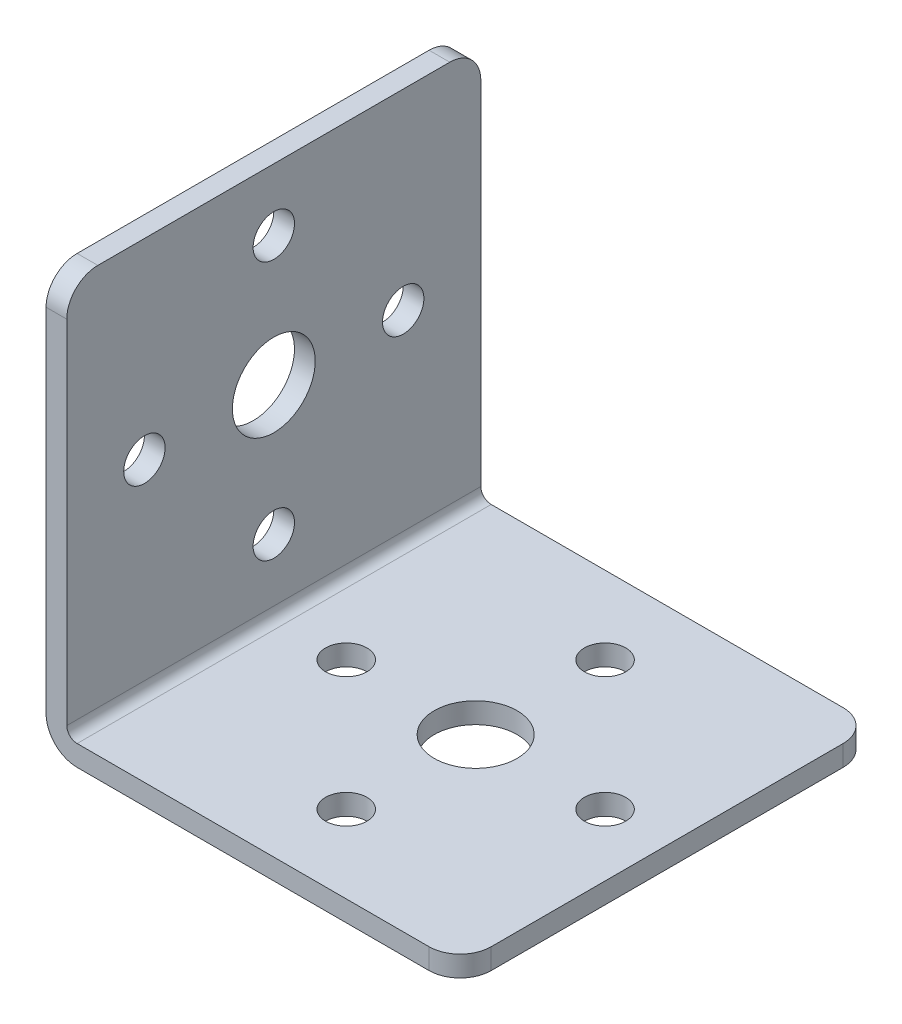
ISO-10303-21;
HEADER;
FILE_DESCRIPTION(('STEP AP214'),'2;1');
FILE_NAME('part.step','',(''),(''),'','','');
FILE_SCHEMA(('AUTOMOTIVE_DESIGN { 1 0 10303 214 1 1 1 1 }'));
ENDSEC;
DATA;
#1=APPLICATION_CONTEXT('core data for automotive mechanical design processes');
#2=APPLICATION_PROTOCOL_DEFINITION('international standard','automotive_design',2000,#1);
#3=PRODUCT_CONTEXT('',#1,'mechanical');
#4=PRODUCT('Part','Part','',(#3));
#5=PRODUCT_RELATED_PRODUCT_CATEGORY('part','',(#4));
#6=PRODUCT_DEFINITION_FORMATION('','',#4);
#7=PRODUCT_DEFINITION_CONTEXT('part definition',#1,'design');
#8=PRODUCT_DEFINITION('design','',#6,#7);
#9=PRODUCT_DEFINITION_SHAPE('','',#8);
#10=(LENGTH_UNIT() NAMED_UNIT(*) SI_UNIT(.MILLI.,.METRE.));
#11=(NAMED_UNIT(*) PLANE_ANGLE_UNIT() SI_UNIT($,.RADIAN.));
#12=(NAMED_UNIT(*) SI_UNIT($,.STERADIAN.) SOLID_ANGLE_UNIT());
#13=UNCERTAINTY_MEASURE_WITH_UNIT(LENGTH_MEASURE(1.E-05),#10,'distance_accuracy_value','');
#14=(GEOMETRIC_REPRESENTATION_CONTEXT(3) GLOBAL_UNCERTAINTY_ASSIGNED_CONTEXT((#13)) GLOBAL_UNIT_ASSIGNED_CONTEXT((#10,
#11,#12)) REPRESENTATION_CONTEXT('',''));
#15=CARTESIAN_POINT('',(0.,0.,0.));
#16=DIRECTION('',(0.,0.,1.));
#17=DIRECTION('',(1.,0.,0.));
#18=AXIS2_PLACEMENT_3D('',#15,#16,#17);
#19=CARTESIAN_POINT('',(-3.,37.,40.));
#20=DIRECTION('',(0.,-1.,0.));
#21=DIRECTION('',(0.,0.,-1.));
#22=AXIS2_PLACEMENT_3D('',#19,#20,#21);
#23=PLANE('',#22);
#24=DIRECTION('',(0.,0.,-1.));
#25=VECTOR('',#24,1.);
#26=CARTESIAN_POINT('',(-3.,37.,40.));
#27=LINE('',#26,#25);
#28=CARTESIAN_POINT('',(-3.,37.,37.));
#29=VERTEX_POINT('',#28);
#30=CARTESIAN_POINT('',(-3.,37.,3.));
#31=VERTEX_POINT('',#30);
#32=EDGE_CURVE('E142',#29,#31,#27,.T.);
#33=ORIENTED_EDGE('',*,*,#32,.F.);
#34=DIRECTION('',(-1.,0.,0.));
#35=VECTOR('',#34,1.);
#36=CARTESIAN_POINT('',(-1.,37.,37.));
#37=LINE('',#36,#35);
#38=CARTESIAN_POINT('',(-1.,37.,37.));
#39=VERTEX_POINT('',#38);
#40=EDGE_CURVE('E54',#29,#39,#37,.F.);
#41=ORIENTED_EDGE('',*,*,#40,.T.);
#42=DIRECTION('',(0.,0.,-1.));
#43=VECTOR('',#42,1.);
#44=CARTESIAN_POINT('',(-1.,37.,40.));
#45=LINE('',#44,#43);
#46=CARTESIAN_POINT('',(-1.,37.,3.));
#47=VERTEX_POINT('',#46);
#48=EDGE_CURVE('E159',#39,#47,#45,.T.);
#49=ORIENTED_EDGE('',*,*,#48,.T.);
#50=DIRECTION('',(-1.,0.,0.));
#51=VECTOR('',#50,1.);
#52=CARTESIAN_POINT('',(-3.,37.,3.));
#53=LINE('',#52,#51);
#54=EDGE_CURVE('E247',#47,#31,#53,.T.);
#55=ORIENTED_EDGE('',*,*,#54,.T.);
#56=EDGE_LOOP('',(#33,#41,#49,#55));
#57=FACE_BOUND('',#56,.T.);
#58=ADVANCED_FACE('F33',(#57),#23,.F.);
#59=CARTESIAN_POINT('',(-3.,37.,40.));
#60=DIRECTION('',(1.,0.,0.));
#61=DIRECTION('',(0.,1.,0.));
#62=AXIS2_PLACEMENT_3D('',#59,#60,#61);
#63=PLANE('',#62);
#64=CARTESIAN_POINT('',(-3.,5.99999999999999,20.));
#65=DIRECTION('',(-1.,0.,0.));
#66=DIRECTION('',(0.,-1.,0.));
#67=AXIS2_PLACEMENT_3D('',#64,#65,#66);
#68=CIRCLE('',#67,2.);
#69=CARTESIAN_POINT('',(-3.,3.99999999999999,20.));
#70=VERTEX_POINT('',#69);
#71=EDGE_CURVE('E208',#70,#70,#68,.T.);
#72=ORIENTED_EDGE('',*,*,#71,.F.);
#73=EDGE_LOOP('',(#72));
#74=FACE_BOUND('',#73,.T.);
#75=CARTESIAN_POINT('',(-3.,18.5,32.5));
#76=DIRECTION('',(-1.,0.,0.));
#77=DIRECTION('',(0.,-1.,0.));
#78=AXIS2_PLACEMENT_3D('',#75,#76,#77);
#79=CIRCLE('',#78,2.);
#80=CARTESIAN_POINT('',(-3.,16.5,32.5));
#81=VERTEX_POINT('',#80);
#82=EDGE_CURVE('E504',#81,#81,#79,.T.);
#83=ORIENTED_EDGE('',*,*,#82,.F.);
#84=EDGE_LOOP('',(#83));
#85=FACE_BOUND('',#84,.T.);
#86=CARTESIAN_POINT('',(-3.,31.,20.));
#87=DIRECTION('',(-1.,0.,0.));
#88=DIRECTION('',(0.,-1.,0.));
#89=AXIS2_PLACEMENT_3D('',#86,#87,#88);
#90=CIRCLE('',#89,2.);
#91=CARTESIAN_POINT('',(-3.,29.,20.));
#92=VERTEX_POINT('',#91);
#93=EDGE_CURVE('E501',#92,#92,#90,.T.);
#94=ORIENTED_EDGE('',*,*,#93,.F.);
#95=EDGE_LOOP('',(#94));
#96=FACE_BOUND('',#95,.T.);
#97=CARTESIAN_POINT('',(-3.,18.5,20.));
#98=DIRECTION('',(-1.,0.,0.));
#99=DIRECTION('',(0.,-1.,0.));
#100=AXIS2_PLACEMENT_3D('',#97,#98,#99);
#101=CIRCLE('',#100,4.);
#102=CARTESIAN_POINT('',(-3.,14.5,20.));
#103=VERTEX_POINT('',#102);
#104=EDGE_CURVE('E196',#103,#103,#101,.T.);
#105=ORIENTED_EDGE('',*,*,#104,.F.);
#106=EDGE_LOOP('',(#105));
#107=FACE_BOUND('',#106,.T.);
#108=CARTESIAN_POINT('',(-3.,18.5,7.5));
#109=DIRECTION('',(-1.,0.,0.));
#110=DIRECTION('',(0.,-1.,0.));
#111=AXIS2_PLACEMENT_3D('',#108,#109,#110);
#112=CIRCLE('',#111,2.);
#113=CARTESIAN_POINT('',(-3.,16.5,7.5));
#114=VERTEX_POINT('',#113);
#115=EDGE_CURVE('E191',#114,#114,#112,.T.);
#116=ORIENTED_EDGE('',*,*,#115,.F.);
#117=EDGE_LOOP('',(#116));
#118=FACE_BOUND('',#117,.T.);
#119=DIRECTION('',(0.,-1.,0.));
#120=VECTOR('',#119,1.);
#121=CARTESIAN_POINT('',(-3.,37.,40.));
#122=LINE('',#121,#120);
#123=CARTESIAN_POINT('',(-3.,34.,40.));
#124=VERTEX_POINT('',#123);
#125=CARTESIAN_POINT('',(-3.,0.,40.));
#126=VERTEX_POINT('',#125);
#127=EDGE_CURVE('E122',#124,#126,#122,.T.);
#128=ORIENTED_EDGE('',*,*,#127,.F.);
#129=CARTESIAN_POINT('',(-3.,34.,37.));
#130=DIRECTION('',(1.,0.,0.));
#131=DIRECTION('',(0.,1.,0.));
#132=AXIS2_PLACEMENT_3D('',#129,#130,#131);
#133=CIRCLE('',#132,3.);
#134=EDGE_CURVE('E245',#124,#29,#133,.F.);
#135=ORIENTED_EDGE('',*,*,#134,.T.);
#136=ORIENTED_EDGE('',*,*,#32,.T.);
#137=CARTESIAN_POINT('',(-3.,34.,3.));
#138=DIRECTION('',(1.,0.,0.));
#139=DIRECTION('',(0.,1.,0.));
#140=AXIS2_PLACEMENT_3D('',#137,#138,#139);
#141=CIRCLE('',#140,3.);
#142=CARTESIAN_POINT('',(-3.,34.,0.));
#143=VERTEX_POINT('',#142);
#144=EDGE_CURVE('E243',#31,#143,#141,.F.);
#145=ORIENTED_EDGE('',*,*,#144,.T.);
#146=DIRECTION('',(0.,-1.,0.));
#147=VECTOR('',#146,1.);
#148=CARTESIAN_POINT('',(-3.,37.,0.));
#149=LINE('',#148,#147);
#150=CARTESIAN_POINT('',(-3.,0.,0.));
#151=VERTEX_POINT('',#150);
#152=EDGE_CURVE('E139',#143,#151,#149,.T.);
#153=ORIENTED_EDGE('',*,*,#152,.T.);
#154=DIRECTION('',(0.,0.,-1.));
#155=VECTOR('',#154,1.);
#156=CARTESIAN_POINT('',(-3.,0.,40.));
#157=LINE('',#156,#155);
#158=EDGE_CURVE('E136',#126,#151,#157,.T.);
#159=ORIENTED_EDGE('',*,*,#158,.F.);
#160=EDGE_LOOP('',(#128,#135,#136,#145,#153,#159));
#161=FACE_BOUND('',#160,.T.);
#162=ADVANCED_FACE('F137',(#74,#85,#96,#107,#118,#161),#63,.F.);
#163=CARTESIAN_POINT('',(0.,0.,40.));
#164=DIRECTION('',(0.,0.,-1.));
#165=DIRECTION('',(-1.,0.,0.));
#166=AXIS2_PLACEMENT_3D('',#163,#164,#165);
#167=CYLINDRICAL_SURFACE('',#166,3.);
#168=CARTESIAN_POINT('',(0.,0.,0.));
#169=DIRECTION('',(0.,0.,1.));
#170=DIRECTION('',(1.,0.,0.));
#171=AXIS2_PLACEMENT_3D('',#168,#169,#170);
#172=CIRCLE('',#171,3.);
#173=CARTESIAN_POINT('',(0.,-3.,0.));
#174=VERTEX_POINT('',#173);
#175=EDGE_CURVE('E161',#151,#174,#172,.T.);
#176=ORIENTED_EDGE('',*,*,#175,.T.);
#177=DIRECTION('',(0.,0.,-1.));
#178=VECTOR('',#177,1.);
#179=CARTESIAN_POINT('',(0.,-3.,40.));
#180=LINE('',#179,#178);
#181=CARTESIAN_POINT('',(0.,-3.,40.));
#182=VERTEX_POINT('',#181);
#183=EDGE_CURVE('E143',#182,#174,#180,.T.);
#184=ORIENTED_EDGE('',*,*,#183,.F.);
#185=CARTESIAN_POINT('',(0.,0.,40.));
#186=DIRECTION('',(0.,0.,1.));
#187=DIRECTION('',(1.,0.,0.));
#188=AXIS2_PLACEMENT_3D('',#185,#186,#187);
#189=CIRCLE('',#188,3.);
#190=EDGE_CURVE('E127',#126,#182,#189,.T.);
#191=ORIENTED_EDGE('',*,*,#190,.F.);
#192=ORIENTED_EDGE('',*,*,#158,.T.);
#193=EDGE_LOOP('',(#176,#184,#191,#192));
#194=FACE_BOUND('',#193,.T.);
#195=ADVANCED_FACE('F145',(#194),#167,.T.);
#196=CARTESIAN_POINT('',(0.,-3.,40.));
#197=DIRECTION('',(0.,1.,0.));
#198=DIRECTION('',(0.,0.,1.));
#199=AXIS2_PLACEMENT_3D('',#196,#197,#198);
#200=PLANE('',#199);
#201=CARTESIAN_POINT('',(31.,-3.,20.));
#202=DIRECTION('',(0.,-1.,0.));
#203=DIRECTION('',(1.,0.,0.));
#204=AXIS2_PLACEMENT_3D('',#201,#202,#203);
#205=CIRCLE('',#204,2.);
#206=CARTESIAN_POINT('',(33.,-3.,20.));
#207=VERTEX_POINT('',#206);
#208=EDGE_CURVE('E519',#207,#207,#205,.T.);
#209=ORIENTED_EDGE('',*,*,#208,.F.);
#210=EDGE_LOOP('',(#209));
#211=FACE_BOUND('',#210,.T.);
#212=CARTESIAN_POINT('',(18.5,-3.,32.5));
#213=DIRECTION('',(0.,-1.,0.));
#214=DIRECTION('',(1.,0.,0.));
#215=AXIS2_PLACEMENT_3D('',#212,#213,#214);
#216=CIRCLE('',#215,2.);
#217=CARTESIAN_POINT('',(20.5,-3.,32.5));
#218=VERTEX_POINT('',#217);
#219=EDGE_CURVE('E516',#218,#218,#216,.T.);
#220=ORIENTED_EDGE('',*,*,#219,.F.);
#221=EDGE_LOOP('',(#220));
#222=FACE_BOUND('',#221,.T.);
#223=CARTESIAN_POINT('',(5.99999999999999,-3.,20.));
#224=DIRECTION('',(0.,-1.,0.));
#225=DIRECTION('',(1.,0.,0.));
#226=AXIS2_PLACEMENT_3D('',#223,#224,#225);
#227=CIRCLE('',#226,2.);
#228=CARTESIAN_POINT('',(7.99999999999999,-3.,20.));
#229=VERTEX_POINT('',#228);
#230=EDGE_CURVE('E513',#229,#229,#227,.T.);
#231=ORIENTED_EDGE('',*,*,#230,.F.);
#232=EDGE_LOOP('',(#231));
#233=FACE_BOUND('',#232,.T.);
#234=CARTESIAN_POINT('',(18.5,-3.,20.));
#235=DIRECTION('',(0.,-1.,0.));
#236=DIRECTION('',(1.,0.,0.));
#237=AXIS2_PLACEMENT_3D('',#234,#235,#236);
#238=CIRCLE('',#237,4.);
#239=CARTESIAN_POINT('',(22.5,-3.,20.));
#240=VERTEX_POINT('',#239);
#241=EDGE_CURVE('E214',#240,#240,#238,.T.);
#242=ORIENTED_EDGE('',*,*,#241,.F.);
#243=EDGE_LOOP('',(#242));
#244=FACE_BOUND('',#243,.T.);
#245=CARTESIAN_POINT('',(18.5,-3.,7.5));
#246=DIRECTION('',(0.,-1.,0.));
#247=DIRECTION('',(1.,0.,0.));
#248=AXIS2_PLACEMENT_3D('',#245,#246,#247);
#249=CIRCLE('',#248,2.);
#250=CARTESIAN_POINT('',(20.5,-3.,7.5));
#251=VERTEX_POINT('',#250);
#252=EDGE_CURVE('E209',#251,#251,#249,.T.);
#253=ORIENTED_EDGE('',*,*,#252,.F.);
#254=EDGE_LOOP('',(#253));
#255=FACE_BOUND('',#254,.T.);
#256=DIRECTION('',(1.,0.,0.));
#257=VECTOR('',#256,1.);
#258=CARTESIAN_POINT('',(0.,-3.,0.));
#259=LINE('',#258,#257);
#260=CARTESIAN_POINT('',(34.,-3.,0.));
#261=VERTEX_POINT('',#260);
#262=EDGE_CURVE('E164',#174,#261,#259,.T.);
#263=ORIENTED_EDGE('',*,*,#262,.T.);
#264=CARTESIAN_POINT('',(34.,-3.,3.));
#265=DIRECTION('',(0.,1.,0.));
#266=DIRECTION('',(0.,0.,1.));
#267=AXIS2_PLACEMENT_3D('',#264,#265,#266);
#268=CIRCLE('',#267,3.);
#269=CARTESIAN_POINT('',(37.,-3.,3.));
#270=VERTEX_POINT('',#269);
#271=EDGE_CURVE('E237',#261,#270,#268,.F.);
#272=ORIENTED_EDGE('',*,*,#271,.T.);
#273=DIRECTION('',(0.,0.,-1.));
#274=VECTOR('',#273,1.);
#275=CARTESIAN_POINT('',(37.,-3.,40.));
#276=LINE('',#275,#274);
#277=CARTESIAN_POINT('',(37.,-3.,37.));
#278=VERTEX_POINT('',#277);
#279=EDGE_CURVE('E182',#278,#270,#276,.T.);
#280=ORIENTED_EDGE('',*,*,#279,.F.);
#281=CARTESIAN_POINT('',(34.,-3.,37.));
#282=DIRECTION('',(0.,1.,0.));
#283=DIRECTION('',(0.,0.,1.));
#284=AXIS2_PLACEMENT_3D('',#281,#282,#283);
#285=CIRCLE('',#284,3.);
#286=CARTESIAN_POINT('',(34.,-3.,40.));
#287=VERTEX_POINT('',#286);
#288=EDGE_CURVE('E235',#278,#287,#285,.F.);
#289=ORIENTED_EDGE('',*,*,#288,.T.);
#290=DIRECTION('',(1.,0.,0.));
#291=VECTOR('',#290,1.);
#292=CARTESIAN_POINT('',(0.,-3.,40.));
#293=LINE('',#292,#291);
#294=EDGE_CURVE('E148',#182,#287,#293,.T.);
#295=ORIENTED_EDGE('',*,*,#294,.F.);
#296=ORIENTED_EDGE('',*,*,#183,.T.);
#297=EDGE_LOOP('',(#263,#272,#280,#289,#295,#296));
#298=FACE_BOUND('',#297,.T.);
#299=ADVANCED_FACE('F297',(#211,#222,#233,#244,#255,#298),#200,.F.);
#300=CARTESIAN_POINT('',(37.,-1.,40.));
#301=DIRECTION('',(-1.,0.,0.));
#302=DIRECTION('',(0.,0.,1.));
#303=AXIS2_PLACEMENT_3D('',#300,#301,#302);
#304=PLANE('',#303);
#305=ORIENTED_EDGE('',*,*,#279,.T.);
#306=DIRECTION('',(0.,1.,0.));
#307=VECTOR('',#306,1.);
#308=CARTESIAN_POINT('',(37.,-1.,3.));
#309=LINE('',#308,#307);
#310=CARTESIAN_POINT('',(37.,-1.,3.));
#311=VERTEX_POINT('',#310);
#312=EDGE_CURVE('E224',#270,#311,#309,.T.);
#313=ORIENTED_EDGE('',*,*,#312,.T.);
#314=DIRECTION('',(0.,0.,-1.));
#315=VECTOR('',#314,1.);
#316=CARTESIAN_POINT('',(37.,-1.,40.));
#317=LINE('',#316,#315);
#318=CARTESIAN_POINT('',(37.,-1.,37.));
#319=VERTEX_POINT('',#318);
#320=EDGE_CURVE('E179',#319,#311,#317,.T.);
#321=ORIENTED_EDGE('',*,*,#320,.F.);
#322=DIRECTION('',(0.,1.,0.));
#323=VECTOR('',#322,1.);
#324=CARTESIAN_POINT('',(37.,-3.,37.));
#325=LINE('',#324,#323);
#326=EDGE_CURVE('E188',#319,#278,#325,.F.);
#327=ORIENTED_EDGE('',*,*,#326,.T.);
#328=EDGE_LOOP('',(#305,#313,#321,#327));
#329=FACE_BOUND('',#328,.T.);
#330=ADVANCED_FACE('F306',(#329),#304,.F.);
#331=CARTESIAN_POINT('',(0.,-1.,40.));
#332=DIRECTION('',(0.,-1.,0.));
#333=DIRECTION('',(0.,0.,-1.));
#334=AXIS2_PLACEMENT_3D('',#331,#332,#333);
#335=PLANE('',#334);
#336=CARTESIAN_POINT('',(31.,-1.,20.));
#337=DIRECTION('',(0.,-1.,0.));
#338=DIRECTION('',(0.,0.,-1.));
#339=AXIS2_PLACEMENT_3D('',#336,#337,#338);
#340=CIRCLE('',#339,2.);
#341=CARTESIAN_POINT('',(31.,-1.,18.));
#342=VERTEX_POINT('',#341);
#343=EDGE_CURVE('E220',#342,#342,#340,.T.);
#344=ORIENTED_EDGE('',*,*,#343,.T.);
#345=EDGE_LOOP('',(#344));
#346=FACE_BOUND('',#345,.T.);
#347=CARTESIAN_POINT('',(18.5,-1.,32.5));
#348=DIRECTION('',(0.,-1.,0.));
#349=DIRECTION('',(0.,0.,-1.));
#350=AXIS2_PLACEMENT_3D('',#347,#348,#349);
#351=CIRCLE('',#350,2.);
#352=CARTESIAN_POINT('',(18.5,-1.,30.5));
#353=VERTEX_POINT('',#352);
#354=EDGE_CURVE('E217',#353,#353,#351,.T.);
#355=ORIENTED_EDGE('',*,*,#354,.T.);
#356=EDGE_LOOP('',(#355));
#357=FACE_BOUND('',#356,.T.);
#358=CARTESIAN_POINT('',(5.99999999999999,-1.,20.));
#359=DIRECTION('',(0.,-1.,0.));
#360=DIRECTION('',(0.,0.,-1.));
#361=AXIS2_PLACEMENT_3D('',#358,#359,#360);
#362=CIRCLE('',#361,2.);
#363=CARTESIAN_POINT('',(5.99999999999999,-1.,18.));
#364=VERTEX_POINT('',#363);
#365=EDGE_CURVE('E213',#364,#364,#362,.T.);
#366=ORIENTED_EDGE('',*,*,#365,.T.);
#367=EDGE_LOOP('',(#366));
#368=FACE_BOUND('',#367,.T.);
#369=CARTESIAN_POINT('',(18.5,-1.,20.));
#370=DIRECTION('',(0.,-1.,0.));
#371=DIRECTION('',(0.,0.,-1.));
#372=AXIS2_PLACEMENT_3D('',#369,#370,#371);
#373=CIRCLE('',#372,4.);
#374=CARTESIAN_POINT('',(18.5,-1.,16.));
#375=VERTEX_POINT('',#374);
#376=EDGE_CURVE('E210',#375,#375,#373,.T.);
#377=ORIENTED_EDGE('',*,*,#376,.T.);
#378=EDGE_LOOP('',(#377));
#379=FACE_BOUND('',#378,.T.);
#380=CARTESIAN_POINT('',(18.5,-1.,7.5));
#381=DIRECTION('',(0.,-1.,0.));
#382=DIRECTION('',(0.,0.,-1.));
#383=AXIS2_PLACEMENT_3D('',#380,#381,#382);
#384=CIRCLE('',#383,2.);
#385=CARTESIAN_POINT('',(18.5,-1.,5.5));
#386=VERTEX_POINT('',#385);
#387=EDGE_CURVE('E205',#386,#386,#384,.T.);
#388=ORIENTED_EDGE('',*,*,#387,.T.);
#389=EDGE_LOOP('',(#388));
#390=FACE_BOUND('',#389,.T.);
#391=ORIENTED_EDGE('',*,*,#320,.T.);
#392=CARTESIAN_POINT('',(34.,-1.,3.));
#393=DIRECTION('',(0.,-1.,0.));
#394=DIRECTION('',(0.,0.,-1.));
#395=AXIS2_PLACEMENT_3D('',#392,#393,#394);
#396=CIRCLE('',#395,3.);
#397=CARTESIAN_POINT('',(34.,-1.,0.));
#398=VERTEX_POINT('',#397);
#399=EDGE_CURVE('E229',#311,#398,#396,.F.);
#400=ORIENTED_EDGE('',*,*,#399,.T.);
#401=DIRECTION('',(-1.,0.,0.));
#402=VECTOR('',#401,1.);
#403=CARTESIAN_POINT('',(0.,-1.,0.));
#404=LINE('',#403,#402);
#405=CARTESIAN_POINT('',(0.,-1.,0.));
#406=VERTEX_POINT('',#405);
#407=EDGE_CURVE('E167',#398,#406,#404,.T.);
#408=ORIENTED_EDGE('',*,*,#407,.T.);
#409=DIRECTION('',(0.,0.,-1.));
#410=VECTOR('',#409,1.);
#411=CARTESIAN_POINT('',(0.,-1.,40.));
#412=LINE('',#411,#410);
#413=CARTESIAN_POINT('',(0.,-1.,40.));
#414=VERTEX_POINT('',#413);
#415=EDGE_CURVE('E176',#414,#406,#412,.T.);
#416=ORIENTED_EDGE('',*,*,#415,.F.);
#417=DIRECTION('',(-1.,0.,0.));
#418=VECTOR('',#417,1.);
#419=CARTESIAN_POINT('',(0.,-1.,40.));
#420=LINE('',#419,#418);
#421=CARTESIAN_POINT('',(34.,-1.,40.));
#422=VERTEX_POINT('',#421);
#423=EDGE_CURVE('E150',#422,#414,#420,.T.);
#424=ORIENTED_EDGE('',*,*,#423,.F.);
#425=CARTESIAN_POINT('',(34.,-1.,37.));
#426=DIRECTION('',(0.,-1.,0.));
#427=DIRECTION('',(0.,0.,-1.));
#428=AXIS2_PLACEMENT_3D('',#425,#426,#427);
#429=CIRCLE('',#428,3.);
#430=EDGE_CURVE('E227',#422,#319,#429,.F.);
#431=ORIENTED_EDGE('',*,*,#430,.T.);
#432=EDGE_LOOP('',(#391,#400,#408,#416,#424,#431));
#433=FACE_BOUND('',#432,.T.);
#434=ADVANCED_FACE('F299',(#346,#357,#368,#379,#390,#433),#335,.F.);
#435=CARTESIAN_POINT('',(0.,0.,40.));
#436=DIRECTION('',(0.,0.,-1.));
#437=DIRECTION('',(-1.,0.,0.));
#438=AXIS2_PLACEMENT_3D('',#435,#436,#437);
#439=CYLINDRICAL_SURFACE('',#438,1.);
#440=CARTESIAN_POINT('',(0.,0.,0.));
#441=DIRECTION('',(0.,0.,-1.));
#442=DIRECTION('',(1.,0.,0.));
#443=AXIS2_PLACEMENT_3D('',#440,#441,#442);
#444=CIRCLE('',#443,1.);
#445=CARTESIAN_POINT('',(-1.,0.,0.));
#446=VERTEX_POINT('',#445);
#447=EDGE_CURVE('E169',#406,#446,#444,.T.);
#448=ORIENTED_EDGE('',*,*,#447,.T.);
#449=DIRECTION('',(0.,0.,-1.));
#450=VECTOR('',#449,1.);
#451=CARTESIAN_POINT('',(-1.,0.,40.));
#452=LINE('',#451,#450);
#453=CARTESIAN_POINT('',(-1.,0.,40.));
#454=VERTEX_POINT('',#453);
#455=EDGE_CURVE('E173',#454,#446,#452,.T.);
#456=ORIENTED_EDGE('',*,*,#455,.F.);
#457=CARTESIAN_POINT('',(0.,0.,40.));
#458=DIRECTION('',(0.,0.,-1.));
#459=DIRECTION('',(1.,0.,0.));
#460=AXIS2_PLACEMENT_3D('',#457,#458,#459);
#461=CIRCLE('',#460,1.);
#462=EDGE_CURVE('E155',#414,#454,#461,.T.);
#463=ORIENTED_EDGE('',*,*,#462,.F.);
#464=ORIENTED_EDGE('',*,*,#415,.T.);
#465=EDGE_LOOP('',(#448,#456,#463,#464));
#466=FACE_BOUND('',#465,.T.);
#467=ADVANCED_FACE('F262',(#466),#439,.F.);
#468=CARTESIAN_POINT('',(-1.,37.,40.));
#469=DIRECTION('',(-1.,0.,0.));
#470=DIRECTION('',(0.,-1.,0.));
#471=AXIS2_PLACEMENT_3D('',#468,#469,#470);
#472=PLANE('',#471);
#473=CARTESIAN_POINT('',(-1.,5.99999999999999,20.));
#474=DIRECTION('',(-1.,0.,0.));
#475=DIRECTION('',(0.,-1.,0.));
#476=AXIS2_PLACEMENT_3D('',#473,#474,#475);
#477=CIRCLE('',#476,2.);
#478=CARTESIAN_POINT('',(-1.,3.99999999999999,20.));
#479=VERTEX_POINT('',#478);
#480=EDGE_CURVE('E202',#479,#479,#477,.T.);
#481=ORIENTED_EDGE('',*,*,#480,.T.);
#482=EDGE_LOOP('',(#481));
#483=FACE_BOUND('',#482,.T.);
#484=CARTESIAN_POINT('',(-1.00000000000001,18.5,32.5));
#485=DIRECTION('',(-1.,0.,0.));
#486=DIRECTION('',(0.,-1.,0.));
#487=AXIS2_PLACEMENT_3D('',#484,#485,#486);
#488=CIRCLE('',#487,2.);
#489=CARTESIAN_POINT('',(-1.00000000000001,16.5,32.5));
#490=VERTEX_POINT('',#489);
#491=EDGE_CURVE('E199',#490,#490,#488,.T.);
#492=ORIENTED_EDGE('',*,*,#491,.T.);
#493=EDGE_LOOP('',(#492));
#494=FACE_BOUND('',#493,.T.);
#495=CARTESIAN_POINT('',(-1.00000000000001,31.,20.));
#496=DIRECTION('',(-1.,0.,0.));
#497=DIRECTION('',(0.,-1.,0.));
#498=AXIS2_PLACEMENT_3D('',#495,#496,#497);
#499=CIRCLE('',#498,2.);
#500=CARTESIAN_POINT('',(-1.00000000000001,29.,20.));
#501=VERTEX_POINT('',#500);
#502=EDGE_CURVE('E195',#501,#501,#499,.T.);
#503=ORIENTED_EDGE('',*,*,#502,.T.);
#504=EDGE_LOOP('',(#503));
#505=FACE_BOUND('',#504,.T.);
#506=CARTESIAN_POINT('',(-1.00000000000001,18.5,20.));
#507=DIRECTION('',(-1.,0.,0.));
#508=DIRECTION('',(0.,-1.,0.));
#509=AXIS2_PLACEMENT_3D('',#506,#507,#508);
#510=CIRCLE('',#509,4.);
#511=CARTESIAN_POINT('',(-1.00000000000001,14.5,20.));
#512=VERTEX_POINT('',#511);
#513=EDGE_CURVE('E192',#512,#512,#510,.T.);
#514=ORIENTED_EDGE('',*,*,#513,.T.);
#515=EDGE_LOOP('',(#514));
#516=FACE_BOUND('',#515,.T.);
#517=CARTESIAN_POINT('',(-1.00000000000001,18.5,7.5));
#518=DIRECTION('',(-1.,0.,0.));
#519=DIRECTION('',(0.,-1.,0.));
#520=AXIS2_PLACEMENT_3D('',#517,#518,#519);
#521=CIRCLE('',#520,2.);
#522=CARTESIAN_POINT('',(-1.00000000000001,16.5,7.5));
#523=VERTEX_POINT('',#522);
#524=EDGE_CURVE('E162',#523,#523,#521,.T.);
#525=ORIENTED_EDGE('',*,*,#524,.T.);
#526=EDGE_LOOP('',(#525));
#527=FACE_BOUND('',#526,.T.);
#528=ORIENTED_EDGE('',*,*,#48,.F.);
#529=CARTESIAN_POINT('',(-1.,34.,37.));
#530=DIRECTION('',(-1.,0.,0.));
#531=DIRECTION('',(0.,-1.,0.));
#532=AXIS2_PLACEMENT_3D('',#529,#530,#531);
#533=CIRCLE('',#532,3.);
#534=CARTESIAN_POINT('',(-1.,34.,40.));
#535=VERTEX_POINT('',#534);
#536=EDGE_CURVE('E11',#39,#535,#533,.F.);
#537=ORIENTED_EDGE('',*,*,#536,.T.);
#538=DIRECTION('',(0.,1.,0.));
#539=VECTOR('',#538,1.);
#540=CARTESIAN_POINT('',(-1.,37.,40.));
#541=LINE('',#540,#539);
#542=EDGE_CURVE('E157',#454,#535,#541,.T.);
#543=ORIENTED_EDGE('',*,*,#542,.F.);
#544=ORIENTED_EDGE('',*,*,#455,.T.);
#545=DIRECTION('',(0.,1.,0.));
#546=VECTOR('',#545,1.);
#547=CARTESIAN_POINT('',(-1.,37.,0.));
#548=LINE('',#547,#546);
#549=CARTESIAN_POINT('',(-1.,34.,0.));
#550=VERTEX_POINT('',#549);
#551=EDGE_CURVE('E133',#446,#550,#548,.T.);
#552=ORIENTED_EDGE('',*,*,#551,.T.);
#553=CARTESIAN_POINT('',(-1.,34.,3.));
#554=DIRECTION('',(-1.,0.,0.));
#555=DIRECTION('',(0.,-1.,0.));
#556=AXIS2_PLACEMENT_3D('',#553,#554,#555);
#557=CIRCLE('',#556,3.);
#558=EDGE_CURVE('E41',#550,#47,#557,.F.);
#559=ORIENTED_EDGE('',*,*,#558,.T.);
#560=EDGE_LOOP('',(#528,#537,#543,#544,#552,#559));
#561=FACE_BOUND('',#560,.T.);
#562=ADVANCED_FACE('F256',(#483,#494,#505,#516,#527,#561),#472,.F.);
#563=CARTESIAN_POINT('',(0.,0.,40.));
#564=DIRECTION('',(0.,0.,1.));
#565=DIRECTION('',(1.,0.,0.));
#566=AXIS2_PLACEMENT_3D('',#563,#564,#565);
#567=PLANE('',#566);
#568=ORIENTED_EDGE('',*,*,#294,.T.);
#569=DIRECTION('',(0.,1.,0.));
#570=VECTOR('',#569,1.);
#571=CARTESIAN_POINT('',(34.,-1.,40.));
#572=LINE('',#571,#570);
#573=EDGE_CURVE('E240',#287,#422,#572,.T.);
#574=ORIENTED_EDGE('',*,*,#573,.T.);
#575=ORIENTED_EDGE('',*,*,#423,.T.);
#576=ORIENTED_EDGE('',*,*,#462,.T.);
#577=ORIENTED_EDGE('',*,*,#542,.T.);
#578=DIRECTION('',(-1.,0.,0.));
#579=VECTOR('',#578,1.);
#580=CARTESIAN_POINT('',(-3.,34.,40.));
#581=LINE('',#580,#579);
#582=EDGE_CURVE('E131',#535,#124,#581,.T.);
#583=ORIENTED_EDGE('',*,*,#582,.T.);
#584=ORIENTED_EDGE('',*,*,#127,.T.);
#585=ORIENTED_EDGE('',*,*,#190,.T.);
#586=EDGE_LOOP('',(#568,#574,#575,#576,#577,#583,#584,#585));
#587=FACE_BOUND('',#586,.T.);
#588=ADVANCED_FACE('F125',(#587),#567,.T.);
#589=CARTESIAN_POINT('',(0.,0.,0.));
#590=DIRECTION('',(0.,0.,1.));
#591=DIRECTION('',(1.,0.,0.));
#592=AXIS2_PLACEMENT_3D('',#589,#590,#591);
#593=PLANE('',#592);
#594=ORIENTED_EDGE('',*,*,#407,.F.);
#595=DIRECTION('',(0.,1.,0.));
#596=VECTOR('',#595,1.);
#597=CARTESIAN_POINT('',(34.,0.,0.));
#598=LINE('',#597,#596);
#599=EDGE_CURVE('E233',#398,#261,#598,.F.);
#600=ORIENTED_EDGE('',*,*,#599,.T.);
#601=ORIENTED_EDGE('',*,*,#262,.F.);
#602=ORIENTED_EDGE('',*,*,#175,.F.);
#603=ORIENTED_EDGE('',*,*,#152,.F.);
#604=DIRECTION('',(-1.,0.,0.));
#605=VECTOR('',#604,1.);
#606=CARTESIAN_POINT('',(0.,34.,0.));
#607=LINE('',#606,#605);
#608=EDGE_CURVE('E231',#143,#550,#607,.F.);
#609=ORIENTED_EDGE('',*,*,#608,.T.);
#610=ORIENTED_EDGE('',*,*,#551,.F.);
#611=ORIENTED_EDGE('',*,*,#447,.F.);
#612=EDGE_LOOP('',(#594,#600,#601,#602,#603,#609,#610,#611));
#613=FACE_BOUND('',#612,.T.);
#614=ADVANCED_FACE('F267',(#613),#593,.F.);
#615=CARTESIAN_POINT('',(37.,18.5,7.5));
#616=DIRECTION('',(-1.,0.,0.));
#617=DIRECTION('',(0.,-1.,0.));
#618=AXIS2_PLACEMENT_3D('',#615,#616,#617);
#619=CYLINDRICAL_SURFACE('',#618,2.);
#620=ORIENTED_EDGE('',*,*,#115,.T.);
#621=EDGE_LOOP('',(#620));
#622=FACE_BOUND('',#621,.T.);
#623=ORIENTED_EDGE('',*,*,#524,.F.);
#624=EDGE_LOOP('',(#623));
#625=FACE_BOUND('',#624,.T.);
#626=ADVANCED_FACE('F368',(#622,#625),#619,.F.);
#627=CARTESIAN_POINT('',(37.,18.5,20.));
#628=DIRECTION('',(-1.,0.,0.));
#629=DIRECTION('',(0.,-1.,0.));
#630=AXIS2_PLACEMENT_3D('',#627,#628,#629);
#631=CYLINDRICAL_SURFACE('',#630,4.);
#632=ORIENTED_EDGE('',*,*,#104,.T.);
#633=EDGE_LOOP('',(#632));
#634=FACE_BOUND('',#633,.T.);
#635=ORIENTED_EDGE('',*,*,#513,.F.);
#636=EDGE_LOOP('',(#635));
#637=FACE_BOUND('',#636,.T.);
#638=ADVANCED_FACE('F454',(#634,#637),#631,.F.);
#639=CARTESIAN_POINT('',(37.,31.,20.));
#640=DIRECTION('',(-1.,0.,0.));
#641=DIRECTION('',(0.,-1.,0.));
#642=AXIS2_PLACEMENT_3D('',#639,#640,#641);
#643=CYLINDRICAL_SURFACE('',#642,2.);
#644=ORIENTED_EDGE('',*,*,#93,.T.);
#645=EDGE_LOOP('',(#644));
#646=FACE_BOUND('',#645,.T.);
#647=ORIENTED_EDGE('',*,*,#502,.F.);
#648=EDGE_LOOP('',(#647));
#649=FACE_BOUND('',#648,.T.);
#650=ADVANCED_FACE('F446',(#646,#649),#643,.F.);
#651=CARTESIAN_POINT('',(37.,18.5,32.5));
#652=DIRECTION('',(-1.,0.,0.));
#653=DIRECTION('',(0.,-1.,0.));
#654=AXIS2_PLACEMENT_3D('',#651,#652,#653);
#655=CYLINDRICAL_SURFACE('',#654,2.);
#656=ORIENTED_EDGE('',*,*,#82,.T.);
#657=EDGE_LOOP('',(#656));
#658=FACE_BOUND('',#657,.T.);
#659=ORIENTED_EDGE('',*,*,#491,.F.);
#660=EDGE_LOOP('',(#659));
#661=FACE_BOUND('',#660,.T.);
#662=ADVANCED_FACE('F438',(#658,#661),#655,.F.);
#663=CARTESIAN_POINT('',(37.,6.,20.));
#664=DIRECTION('',(-1.,0.,0.));
#665=DIRECTION('',(0.,-1.,0.));
#666=AXIS2_PLACEMENT_3D('',#663,#664,#665);
#667=CYLINDRICAL_SURFACE('',#666,2.);
#668=ORIENTED_EDGE('',*,*,#71,.T.);
#669=EDGE_LOOP('',(#668));
#670=FACE_BOUND('',#669,.T.);
#671=ORIENTED_EDGE('',*,*,#480,.F.);
#672=EDGE_LOOP('',(#671));
#673=FACE_BOUND('',#672,.T.);
#674=ADVANCED_FACE('F430',(#670,#673),#667,.F.);
#675=CARTESIAN_POINT('',(18.5,37.,7.5));
#676=DIRECTION('',(0.,-1.,0.));
#677=DIRECTION('',(1.,0.,0.));
#678=AXIS2_PLACEMENT_3D('',#675,#676,#677);
#679=CYLINDRICAL_SURFACE('',#678,2.);
#680=ORIENTED_EDGE('',*,*,#252,.T.);
#681=EDGE_LOOP('',(#680));
#682=FACE_BOUND('',#681,.T.);
#683=ORIENTED_EDGE('',*,*,#387,.F.);
#684=EDGE_LOOP('',(#683));
#685=FACE_BOUND('',#684,.T.);
#686=ADVANCED_FACE('F422',(#682,#685),#679,.F.);
#687=CARTESIAN_POINT('',(18.5,37.,20.));
#688=DIRECTION('',(0.,-1.,0.));
#689=DIRECTION('',(1.,0.,0.));
#690=AXIS2_PLACEMENT_3D('',#687,#688,#689);
#691=CYLINDRICAL_SURFACE('',#690,4.);
#692=ORIENTED_EDGE('',*,*,#241,.T.);
#693=EDGE_LOOP('',(#692));
#694=FACE_BOUND('',#693,.T.);
#695=ORIENTED_EDGE('',*,*,#376,.F.);
#696=EDGE_LOOP('',(#695));
#697=FACE_BOUND('',#696,.T.);
#698=ADVANCED_FACE('F414',(#694,#697),#691,.F.);
#699=CARTESIAN_POINT('',(5.99999999999999,37.,20.));
#700=DIRECTION('',(0.,-1.,0.));
#701=DIRECTION('',(1.,0.,0.));
#702=AXIS2_PLACEMENT_3D('',#699,#700,#701);
#703=CYLINDRICAL_SURFACE('',#702,2.);
#704=ORIENTED_EDGE('',*,*,#230,.T.);
#705=EDGE_LOOP('',(#704));
#706=FACE_BOUND('',#705,.T.);
#707=ORIENTED_EDGE('',*,*,#365,.F.);
#708=EDGE_LOOP('',(#707));
#709=FACE_BOUND('',#708,.T.);
#710=ADVANCED_FACE('F406',(#706,#709),#703,.F.);
#711=CARTESIAN_POINT('',(18.5,37.,32.5));
#712=DIRECTION('',(0.,-1.,0.));
#713=DIRECTION('',(1.,0.,0.));
#714=AXIS2_PLACEMENT_3D('',#711,#712,#713);
#715=CYLINDRICAL_SURFACE('',#714,2.);
#716=ORIENTED_EDGE('',*,*,#219,.T.);
#717=EDGE_LOOP('',(#716));
#718=FACE_BOUND('',#717,.T.);
#719=ORIENTED_EDGE('',*,*,#354,.F.);
#720=EDGE_LOOP('',(#719));
#721=FACE_BOUND('',#720,.T.);
#722=ADVANCED_FACE('F399',(#718,#721),#715,.F.);
#723=CARTESIAN_POINT('',(31.,37.,20.));
#724=DIRECTION('',(0.,-1.,0.));
#725=DIRECTION('',(1.,0.,0.));
#726=AXIS2_PLACEMENT_3D('',#723,#724,#725);
#727=CYLINDRICAL_SURFACE('',#726,2.);
#728=ORIENTED_EDGE('',*,*,#208,.T.);
#729=EDGE_LOOP('',(#728));
#730=FACE_BOUND('',#729,.T.);
#731=ORIENTED_EDGE('',*,*,#343,.F.);
#732=EDGE_LOOP('',(#731));
#733=FACE_BOUND('',#732,.T.);
#734=ADVANCED_FACE('F286',(#730,#733),#727,.F.);
#735=CARTESIAN_POINT('',(34.,-1.,3.));
#736=DIRECTION('',(0.,1.,0.));
#737=DIRECTION('',(0.,0.,1.));
#738=AXIS2_PLACEMENT_3D('',#735,#736,#737);
#739=CYLINDRICAL_SURFACE('',#738,3.);
#740=ORIENTED_EDGE('',*,*,#271,.F.);
#741=ORIENTED_EDGE('',*,*,#599,.F.);
#742=ORIENTED_EDGE('',*,*,#399,.F.);
#743=ORIENTED_EDGE('',*,*,#312,.F.);
#744=EDGE_LOOP('',(#740,#741,#742,#743));
#745=FACE_BOUND('',#744,.T.);
#746=ADVANCED_FACE('F283',(#745),#739,.T.);
#747=CARTESIAN_POINT('',(34.,0.,37.));
#748=DIRECTION('',(0.,-1.,0.));
#749=DIRECTION('',(0.,0.,-1.));
#750=AXIS2_PLACEMENT_3D('',#747,#748,#749);
#751=CYLINDRICAL_SURFACE('',#750,3.);
#752=ORIENTED_EDGE('',*,*,#288,.F.);
#753=ORIENTED_EDGE('',*,*,#326,.F.);
#754=ORIENTED_EDGE('',*,*,#430,.F.);
#755=ORIENTED_EDGE('',*,*,#573,.F.);
#756=EDGE_LOOP('',(#752,#753,#754,#755));
#757=FACE_BOUND('',#756,.T.);
#758=ADVANCED_FACE('F273',(#757),#751,.T.);
#759=CARTESIAN_POINT('',(0.,34.,37.));
#760=DIRECTION('',(1.,0.,0.));
#761=DIRECTION('',(0.,0.,-1.));
#762=AXIS2_PLACEMENT_3D('',#759,#760,#761);
#763=CYLINDRICAL_SURFACE('',#762,3.);
#764=ORIENTED_EDGE('',*,*,#536,.F.);
#765=ORIENTED_EDGE('',*,*,#40,.F.);
#766=ORIENTED_EDGE('',*,*,#134,.F.);
#767=ORIENTED_EDGE('',*,*,#582,.F.);
#768=EDGE_LOOP('',(#764,#765,#766,#767));
#769=FACE_BOUND('',#768,.T.);
#770=ADVANCED_FACE('F254',(#769),#763,.T.);
#771=CARTESIAN_POINT('',(-3.,34.,3.));
#772=DIRECTION('',(-1.,0.,0.));
#773=DIRECTION('',(0.,0.,1.));
#774=AXIS2_PLACEMENT_3D('',#771,#772,#773);
#775=CYLINDRICAL_SURFACE('',#774,3.);
#776=ORIENTED_EDGE('',*,*,#558,.F.);
#777=ORIENTED_EDGE('',*,*,#608,.F.);
#778=ORIENTED_EDGE('',*,*,#144,.F.);
#779=ORIENTED_EDGE('',*,*,#54,.F.);
#780=EDGE_LOOP('',(#776,#777,#778,#779));
#781=FACE_BOUND('',#780,.T.);
#782=ADVANCED_FACE('F35',(#781),#775,.T.);
#783=CLOSED_SHELL('',(#58,#162,#195,#299,#330,#434,#467,#562,#588,#614,#626,#638,#650,#662,#674,
#686,#698,#710,#722,#734,#746,#758,#770,#782));
#784=MANIFOLD_SOLID_BREP('B2',#783);
#785=ADVANCED_BREP_SHAPE_REPRESENTATION('',(#18,#784),#14);
#786=SHAPE_DEFINITION_REPRESENTATION(#9,#785);
ENDSEC;
END-ISO-10303-21;
